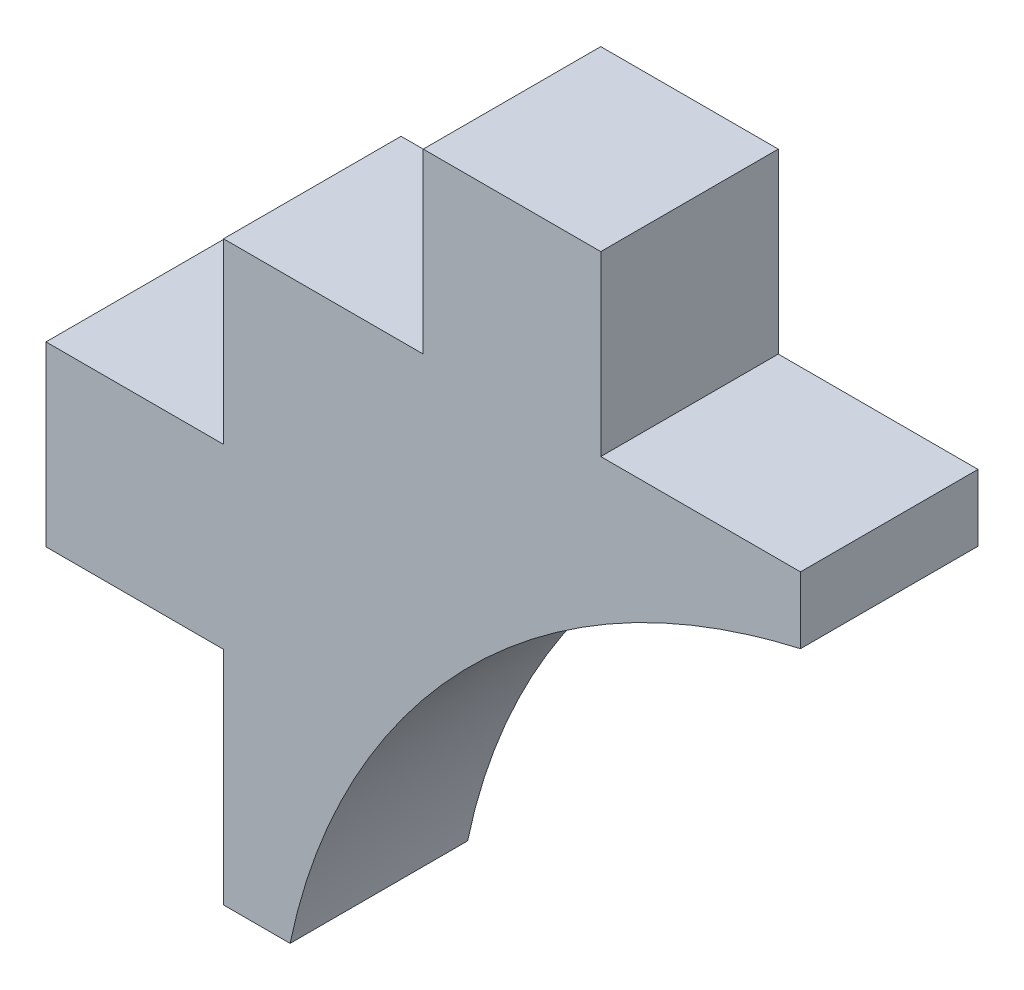
ISO-10303-21;
HEADER;
FILE_DESCRIPTION(('STEP AP214'),'2;1');
FILE_NAME('part.step','',(''),(''),'','','');
FILE_SCHEMA(('AUTOMOTIVE_DESIGN { 1 0 10303 214 1 1 1 1 }'));
ENDSEC;
DATA;
#1=APPLICATION_CONTEXT('core data for automotive mechanical design processes');
#2=APPLICATION_PROTOCOL_DEFINITION('international standard','automotive_design',2000,#1);
#3=PRODUCT_CONTEXT('',#1,'mechanical');
#4=PRODUCT('Part','Part','',(#3));
#5=PRODUCT_RELATED_PRODUCT_CATEGORY('part','',(#4));
#6=PRODUCT_DEFINITION_FORMATION('','',#4);
#7=PRODUCT_DEFINITION_CONTEXT('part definition',#1,'design');
#8=PRODUCT_DEFINITION('design','',#6,#7);
#9=PRODUCT_DEFINITION_SHAPE('','',#8);
#10=(LENGTH_UNIT() NAMED_UNIT(*) SI_UNIT(.MILLI.,.METRE.));
#11=(NAMED_UNIT(*) PLANE_ANGLE_UNIT() SI_UNIT($,.RADIAN.));
#12=(NAMED_UNIT(*) SI_UNIT($,.STERADIAN.) SOLID_ANGLE_UNIT());
#13=UNCERTAINTY_MEASURE_WITH_UNIT(LENGTH_MEASURE(1.E-05),#10,'distance_accuracy_value','');
#14=(GEOMETRIC_REPRESENTATION_CONTEXT(3) GLOBAL_UNCERTAINTY_ASSIGNED_CONTEXT((#13)) GLOBAL_UNIT_ASSIGNED_CONTEXT((#10,
#11,#12)) REPRESENTATION_CONTEXT('',''));
#15=CARTESIAN_POINT('',(0.,0.,0.));
#16=DIRECTION('',(0.,0.,1.));
#17=DIRECTION('',(1.,0.,0.));
#18=AXIS2_PLACEMENT_3D('',#15,#16,#17);
#19=CARTESIAN_POINT('',(0.,4.98785290780557,4.));
#20=DIRECTION('',(1.,0.,0.));
#21=DIRECTION('',(0.,1.,0.));
#22=AXIS2_PLACEMENT_3D('',#19,#20,#21);
#23=PLANE('',#22);
#24=DIRECTION('',(0.,-1.,0.));
#25=VECTOR('',#24,1.);
#26=CARTESIAN_POINT('',(0.,4.98785290780557,0.));
#27=LINE('',#26,#25);
#28=CARTESIAN_POINT('',(0.,4.98785290780557,0.));
#29=VERTEX_POINT('',#28);
#30=CARTESIAN_POINT('',(0.,0.,0.));
#31=VERTEX_POINT('',#30);
#32=EDGE_CURVE('E170',#29,#31,#27,.T.);
#33=ORIENTED_EDGE('',*,*,#32,.T.);
#34=DIRECTION('',(0.,0.,-1.));
#35=VECTOR('',#34,1.);
#36=CARTESIAN_POINT('',(0.,0.,4.));
#37=LINE('',#36,#35);
#38=CARTESIAN_POINT('',(0.,0.,4.));
#39=VERTEX_POINT('',#38);
#40=EDGE_CURVE('E11',#39,#31,#37,.T.);
#41=ORIENTED_EDGE('',*,*,#40,.F.);
#42=DIRECTION('',(0.,-1.,0.));
#43=VECTOR('',#42,1.);
#44=CARTESIAN_POINT('',(0.,4.98785290780557,4.));
#45=LINE('',#44,#43);
#46=CARTESIAN_POINT('',(0.,4.98785290780557,4.));
#47=VERTEX_POINT('',#46);
#48=EDGE_CURVE('E212',#47,#39,#45,.T.);
#49=ORIENTED_EDGE('',*,*,#48,.F.);
#50=DIRECTION('',(0.,0.,-1.));
#51=VECTOR('',#50,1.);
#52=CARTESIAN_POINT('',(0.,4.98785290780557,4.));
#53=LINE('',#52,#51);
#54=EDGE_CURVE('E166',#47,#29,#53,.T.);
#55=ORIENTED_EDGE('',*,*,#54,.T.);
#56=EDGE_LOOP('',(#33,#41,#49,#55));
#57=FACE_BOUND('',#56,.T.);
#58=ADVANCED_FACE('F39',(#57),#23,.F.);
#59=CARTESIAN_POINT('',(0.,0.,4.));
#60=DIRECTION('',(0.,1.,0.));
#61=DIRECTION('',(0.,0.,1.));
#62=AXIS2_PLACEMENT_3D('',#59,#60,#61);
#63=PLANE('',#62);
#64=DIRECTION('',(1.,0.,0.));
#65=VECTOR('',#64,1.);
#66=CARTESIAN_POINT('',(0.,0.,0.));
#67=LINE('',#66,#65);
#68=CARTESIAN_POINT('',(1.5,0.,0.));
#69=VERTEX_POINT('',#68);
#70=EDGE_CURVE('E174',#31,#69,#67,.T.);
#71=ORIENTED_EDGE('',*,*,#70,.T.);
#72=DIRECTION('',(0.,0.,-1.));
#73=VECTOR('',#72,1.);
#74=CARTESIAN_POINT('',(1.5,0.,4.));
#75=LINE('',#74,#73);
#76=CARTESIAN_POINT('',(1.5,0.,4.));
#77=VERTEX_POINT('',#76);
#78=EDGE_CURVE('E48',#77,#69,#75,.T.);
#79=ORIENTED_EDGE('',*,*,#78,.F.);
#80=DIRECTION('',(1.,0.,0.));
#81=VECTOR('',#80,1.);
#82=CARTESIAN_POINT('',(0.,0.,4.));
#83=LINE('',#82,#81);
#84=EDGE_CURVE('E114',#39,#77,#83,.T.);
#85=ORIENTED_EDGE('',*,*,#84,.F.);
#86=ORIENTED_EDGE('',*,*,#40,.T.);
#87=EDGE_LOOP('',(#71,#79,#85,#86));
#88=FACE_BOUND('',#87,.T.);
#89=ADVANCED_FACE('F313',(#88),#63,.F.);
#90=CARTESIAN_POINT('',(1.5,0.,4.));
#91=CARTESIAN_POINT('',(2.5203584895098,4.95036623095251,4.));
#92=CARTESIAN_POINT('',(6.47398622800316,10.0170191379073,4.));
#93=CARTESIAN_POINT('',(13.,11.5,4.));
#94=B_SPLINE_CURVE_WITH_KNOTS('',3,(#90,#91,#92,#93),.UNSPECIFIED.,.F.,.F.,(4,4),(0.,1.),.UNSPECIFIED.);
#95=DIRECTION('',(0.,0.,-1.));
#96=VECTOR('',#95,1.);
#97=SURFACE_OF_LINEAR_EXTRUSION('',#94,#96);
#98=CARTESIAN_POINT('',(1.5,0.,0.));
#99=CARTESIAN_POINT('',(2.5203584895098,4.95036623095251,0.));
#100=CARTESIAN_POINT('',(6.47398622800316,10.0170191379073,0.));
#101=CARTESIAN_POINT('',(13.,11.5,0.));
#102=B_SPLINE_CURVE_WITH_KNOTS('',3,(#98,#99,#100,#101),.UNSPECIFIED.,.F.,.F.,(4,4),(0.,1.),.UNSPECIFIED.);
#103=CARTESIAN_POINT('',(13.,11.5,0.));
#104=VERTEX_POINT('',#103);
#105=EDGE_CURVE('E177',#69,#104,#102,.T.);
#106=ORIENTED_EDGE('',*,*,#105,.T.);
#107=DIRECTION('',(0.,0.,-1.));
#108=VECTOR('',#107,1.);
#109=CARTESIAN_POINT('',(13.,11.5,4.));
#110=LINE('',#109,#108);
#111=CARTESIAN_POINT('',(13.,11.5,4.));
#112=VERTEX_POINT('',#111);
#113=EDGE_CURVE('E243',#112,#104,#110,.T.);
#114=ORIENTED_EDGE('',*,*,#113,.F.);
#115=EDGE_CURVE('E253',#77,#112,#94,.T.);
#116=ORIENTED_EDGE('',*,*,#115,.F.);
#117=ORIENTED_EDGE('',*,*,#78,.T.);
#118=EDGE_LOOP('',(#106,#114,#116,#117));
#119=FACE_BOUND('',#118,.T.);
#120=ADVANCED_FACE('F251',(#119),#97,.F.);
#121=CARTESIAN_POINT('',(13.,13.,4.));
#122=DIRECTION('',(-1.,0.,0.));
#123=DIRECTION('',(0.,0.,1.));
#124=AXIS2_PLACEMENT_3D('',#121,#122,#123);
#125=PLANE('',#124);
#126=DIRECTION('',(0.,1.,0.));
#127=VECTOR('',#126,1.);
#128=CARTESIAN_POINT('',(13.,13.,0.));
#129=LINE('',#128,#127);
#130=CARTESIAN_POINT('',(13.,13.,0.));
#131=VERTEX_POINT('',#130);
#132=EDGE_CURVE('E182',#104,#131,#129,.T.);
#133=ORIENTED_EDGE('',*,*,#132,.T.);
#134=DIRECTION('',(0.,0.,-1.));
#135=VECTOR('',#134,1.);
#136=CARTESIAN_POINT('',(13.,13.,4.));
#137=LINE('',#136,#135);
#138=CARTESIAN_POINT('',(13.,13.,4.));
#139=VERTEX_POINT('',#138);
#140=EDGE_CURVE('E239',#139,#131,#137,.T.);
#141=ORIENTED_EDGE('',*,*,#140,.F.);
#142=DIRECTION('',(0.,1.,0.));
#143=VECTOR('',#142,1.);
#144=CARTESIAN_POINT('',(13.,13.,4.));
#145=LINE('',#144,#143);
#146=EDGE_CURVE('E272',#112,#139,#145,.T.);
#147=ORIENTED_EDGE('',*,*,#146,.F.);
#148=ORIENTED_EDGE('',*,*,#113,.T.);
#149=EDGE_LOOP('',(#133,#141,#147,#148));
#150=FACE_BOUND('',#149,.T.);
#151=ADVANCED_FACE('F262',(#150),#125,.F.);
#152=CARTESIAN_POINT('',(8.5,13.,4.));
#153=DIRECTION('',(0.,-1.,0.));
#154=DIRECTION('',(0.,0.,-1.));
#155=AXIS2_PLACEMENT_3D('',#152,#153,#154);
#156=PLANE('',#155);
#157=DIRECTION('',(-1.,0.,0.));
#158=VECTOR('',#157,1.);
#159=CARTESIAN_POINT('',(8.5,13.,0.));
#160=LINE('',#159,#158);
#161=CARTESIAN_POINT('',(8.5,13.,0.));
#162=VERTEX_POINT('',#161);
#163=EDGE_CURVE('E188',#131,#162,#160,.T.);
#164=ORIENTED_EDGE('',*,*,#163,.T.);
#165=DIRECTION('',(0.,0.,-1.));
#166=VECTOR('',#165,1.);
#167=CARTESIAN_POINT('',(8.5,13.,4.));
#168=LINE('',#167,#166);
#169=CARTESIAN_POINT('',(8.5,13.,4.));
#170=VERTEX_POINT('',#169);
#171=EDGE_CURVE('E235',#170,#162,#168,.T.);
#172=ORIENTED_EDGE('',*,*,#171,.F.);
#173=DIRECTION('',(-1.,0.,0.));
#174=VECTOR('',#173,1.);
#175=CARTESIAN_POINT('',(8.5,13.,4.));
#176=LINE('',#175,#174);
#177=EDGE_CURVE('E268',#139,#170,#176,.T.);
#178=ORIENTED_EDGE('',*,*,#177,.F.);
#179=ORIENTED_EDGE('',*,*,#140,.T.);
#180=EDGE_LOOP('',(#164,#172,#178,#179));
#181=FACE_BOUND('',#180,.T.);
#182=ADVANCED_FACE('F266',(#181),#156,.F.);
#183=CARTESIAN_POINT('',(8.5,17.,4.));
#184=DIRECTION('',(-1.,0.,0.));
#185=DIRECTION('',(0.,0.,1.));
#186=AXIS2_PLACEMENT_3D('',#183,#184,#185);
#187=PLANE('',#186);
#188=DIRECTION('',(0.,1.,0.));
#189=VECTOR('',#188,1.);
#190=CARTESIAN_POINT('',(8.5,17.,0.));
#191=LINE('',#190,#189);
#192=CARTESIAN_POINT('',(8.5,17.,0.));
#193=VERTEX_POINT('',#192);
#194=EDGE_CURVE('E191',#162,#193,#191,.T.);
#195=ORIENTED_EDGE('',*,*,#194,.T.);
#196=DIRECTION('',(0.,0.,-1.));
#197=VECTOR('',#196,1.);
#198=CARTESIAN_POINT('',(8.5,17.,4.));
#199=LINE('',#198,#197);
#200=CARTESIAN_POINT('',(8.5,17.,4.));
#201=VERTEX_POINT('',#200);
#202=EDGE_CURVE('E231',#201,#193,#199,.T.);
#203=ORIENTED_EDGE('',*,*,#202,.F.);
#204=DIRECTION('',(0.,1.,0.));
#205=VECTOR('',#204,1.);
#206=CARTESIAN_POINT('',(8.5,17.,4.));
#207=LINE('',#206,#205);
#208=EDGE_CURVE('E271',#170,#201,#207,.T.);
#209=ORIENTED_EDGE('',*,*,#208,.F.);
#210=ORIENTED_EDGE('',*,*,#171,.T.);
#211=EDGE_LOOP('',(#195,#203,#209,#210));
#212=FACE_BOUND('',#211,.T.);
#213=ADVANCED_FACE('F337',(#212),#187,.F.);
#214=CARTESIAN_POINT('',(4.5,17.,4.));
#215=DIRECTION('',(0.,-1.,0.));
#216=DIRECTION('',(0.,0.,-1.));
#217=AXIS2_PLACEMENT_3D('',#214,#215,#216);
#218=PLANE('',#217);
#219=DIRECTION('',(-1.,0.,0.));
#220=VECTOR('',#219,1.);
#221=CARTESIAN_POINT('',(4.5,17.,0.));
#222=LINE('',#221,#220);
#223=CARTESIAN_POINT('',(4.5,17.,0.));
#224=VERTEX_POINT('',#223);
#225=EDGE_CURVE('E194',#193,#224,#222,.T.);
#226=ORIENTED_EDGE('',*,*,#225,.T.);
#227=DIRECTION('',(0.,0.,-1.));
#228=VECTOR('',#227,1.);
#229=CARTESIAN_POINT('',(4.5,17.,4.));
#230=LINE('',#229,#228);
#231=CARTESIAN_POINT('',(4.5,17.,4.));
#232=VERTEX_POINT('',#231);
#233=EDGE_CURVE('E227',#232,#224,#230,.T.);
#234=ORIENTED_EDGE('',*,*,#233,.F.);
#235=DIRECTION('',(-1.,0.,0.));
#236=VECTOR('',#235,1.);
#237=CARTESIAN_POINT('',(4.5,17.,4.));
#238=LINE('',#237,#236);
#239=EDGE_CURVE('E276',#201,#232,#238,.T.);
#240=ORIENTED_EDGE('',*,*,#239,.F.);
#241=ORIENTED_EDGE('',*,*,#202,.T.);
#242=EDGE_LOOP('',(#226,#234,#240,#241));
#243=FACE_BOUND('',#242,.T.);
#244=ADVANCED_FACE('F340',(#243),#218,.F.);
#245=CARTESIAN_POINT('',(4.5,13.,4.));
#246=DIRECTION('',(1.,0.,0.));
#247=DIRECTION('',(0.,1.,0.));
#248=AXIS2_PLACEMENT_3D('',#245,#246,#247);
#249=PLANE('',#248);
#250=DIRECTION('',(0.,-1.,0.));
#251=VECTOR('',#250,1.);
#252=CARTESIAN_POINT('',(4.5,13.,0.));
#253=LINE('',#252,#251);
#254=CARTESIAN_POINT('',(4.5,13.,0.));
#255=VERTEX_POINT('',#254);
#256=EDGE_CURVE('E197',#224,#255,#253,.T.);
#257=ORIENTED_EDGE('',*,*,#256,.T.);
#258=DIRECTION('',(0.,0.,-1.));
#259=VECTOR('',#258,1.);
#260=CARTESIAN_POINT('',(4.5,13.,4.));
#261=LINE('',#260,#259);
#262=CARTESIAN_POINT('',(4.5,13.,4.));
#263=VERTEX_POINT('',#262);
#264=EDGE_CURVE('E223',#263,#255,#261,.T.);
#265=ORIENTED_EDGE('',*,*,#264,.F.);
#266=DIRECTION('',(0.,-1.,0.));
#267=VECTOR('',#266,1.);
#268=CARTESIAN_POINT('',(4.5,13.,4.));
#269=LINE('',#268,#267);
#270=EDGE_CURVE('E283',#232,#263,#269,.T.);
#271=ORIENTED_EDGE('',*,*,#270,.F.);
#272=ORIENTED_EDGE('',*,*,#233,.T.);
#273=EDGE_LOOP('',(#257,#265,#271,#272));
#274=FACE_BOUND('',#273,.T.);
#275=ADVANCED_FACE('F344',(#274),#249,.F.);
#276=CARTESIAN_POINT('',(0.,13.,4.));
#277=DIRECTION('',(0.,-1.,0.));
#278=DIRECTION('',(0.,0.,-1.));
#279=AXIS2_PLACEMENT_3D('',#276,#277,#278);
#280=PLANE('',#279);
#281=DIRECTION('',(-1.,0.,0.));
#282=VECTOR('',#281,1.);
#283=CARTESIAN_POINT('',(0.,13.,0.));
#284=LINE('',#283,#282);
#285=CARTESIAN_POINT('',(0.,13.,0.));
#286=VERTEX_POINT('',#285);
#287=EDGE_CURVE('E200',#255,#286,#284,.T.);
#288=ORIENTED_EDGE('',*,*,#287,.T.);
#289=DIRECTION('',(0.,0.,-1.));
#290=VECTOR('',#289,1.);
#291=CARTESIAN_POINT('',(0.,13.,4.));
#292=LINE('',#291,#290);
#293=CARTESIAN_POINT('',(0.,13.,4.));
#294=VERTEX_POINT('',#293);
#295=EDGE_CURVE('E219',#294,#286,#292,.T.);
#296=ORIENTED_EDGE('',*,*,#295,.F.);
#297=DIRECTION('',(-1.,0.,0.));
#298=VECTOR('',#297,1.);
#299=CARTESIAN_POINT('',(0.,13.,4.));
#300=LINE('',#299,#298);
#301=EDGE_CURVE('E286',#263,#294,#300,.T.);
#302=ORIENTED_EDGE('',*,*,#301,.F.);
#303=ORIENTED_EDGE('',*,*,#264,.T.);
#304=EDGE_LOOP('',(#288,#296,#302,#303));
#305=FACE_BOUND('',#304,.T.);
#306=ADVANCED_FACE('F294',(#305),#280,.F.);
#307=CARTESIAN_POINT('',(0.,13.,4.));
#308=DIRECTION('',(1.,0.,0.));
#309=DIRECTION('',(0.,0.,-1.));
#310=AXIS2_PLACEMENT_3D('',#307,#308,#309);
#311=PLANE('',#310);
#312=DIRECTION('',(0.,-1.,0.));
#313=VECTOR('',#312,1.);
#314=CARTESIAN_POINT('',(0.,13.,0.));
#315=LINE('',#314,#313);
#316=CARTESIAN_POINT('',(0.,8.98785290780557,0.));
#317=VERTEX_POINT('',#316);
#318=EDGE_CURVE('E203',#286,#317,#315,.T.);
#319=ORIENTED_EDGE('',*,*,#318,.T.);
#320=DIRECTION('',(0.,0.,-1.));
#321=VECTOR('',#320,1.);
#322=CARTESIAN_POINT('',(0.,8.98785290780557,4.));
#323=LINE('',#322,#321);
#324=CARTESIAN_POINT('',(0.,8.98785290780557,4.));
#325=VERTEX_POINT('',#324);
#326=EDGE_CURVE('E159',#325,#317,#323,.T.);
#327=ORIENTED_EDGE('',*,*,#326,.F.);
#328=DIRECTION('',(0.,-1.,0.));
#329=VECTOR('',#328,1.);
#330=CARTESIAN_POINT('',(0.,13.,4.));
#331=LINE('',#330,#329);
#332=EDGE_CURVE('E148',#294,#325,#331,.T.);
#333=ORIENTED_EDGE('',*,*,#332,.F.);
#334=ORIENTED_EDGE('',*,*,#295,.T.);
#335=EDGE_LOOP('',(#319,#327,#333,#334));
#336=FACE_BOUND('',#335,.T.);
#337=ADVANCED_FACE('F298',(#336),#311,.F.);
#338=CARTESIAN_POINT('',(0.,8.98785290780557,4.));
#339=DIRECTION('',(0.,-1.,0.));
#340=DIRECTION('',(0.,0.,-1.));
#341=AXIS2_PLACEMENT_3D('',#338,#339,#340);
#342=PLANE('',#341);
#343=DIRECTION('',(-1.,0.,0.));
#344=VECTOR('',#343,1.);
#345=CARTESIAN_POINT('',(0.,8.98785290780557,0.));
#346=LINE('',#345,#344);
#347=CARTESIAN_POINT('',(-4.,8.98785290780557,0.));
#348=VERTEX_POINT('',#347);
#349=EDGE_CURVE('E157',#317,#348,#346,.T.);
#350=ORIENTED_EDGE('',*,*,#349,.T.);
#351=DIRECTION('',(0.,0.,-1.));
#352=VECTOR('',#351,1.);
#353=CARTESIAN_POINT('',(-4.,8.98785290780557,4.));
#354=LINE('',#353,#352);
#355=CARTESIAN_POINT('',(-4.,8.98785290780557,4.));
#356=VERTEX_POINT('',#355);
#357=EDGE_CURVE('E154',#356,#348,#354,.T.);
#358=ORIENTED_EDGE('',*,*,#357,.F.);
#359=DIRECTION('',(-1.,0.,0.));
#360=VECTOR('',#359,1.);
#361=CARTESIAN_POINT('',(0.,8.98785290780557,4.));
#362=LINE('',#361,#360);
#363=EDGE_CURVE('E142',#325,#356,#362,.T.);
#364=ORIENTED_EDGE('',*,*,#363,.F.);
#365=ORIENTED_EDGE('',*,*,#326,.T.);
#366=EDGE_LOOP('',(#350,#358,#364,#365));
#367=FACE_BOUND('',#366,.T.);
#368=ADVANCED_FACE('F155',(#367),#342,.F.);
#369=CARTESIAN_POINT('',(-4.,8.98785290780557,4.));
#370=DIRECTION('',(1.,0.,0.));
#371=DIRECTION('',(0.,1.,0.));
#372=AXIS2_PLACEMENT_3D('',#369,#370,#371);
#373=PLANE('',#372);
#374=DIRECTION('',(0.,-1.,0.));
#375=VECTOR('',#374,1.);
#376=CARTESIAN_POINT('',(-4.,8.98785290780557,0.));
#377=LINE('',#376,#375);
#378=CARTESIAN_POINT('',(-4.,4.98785290780557,0.));
#379=VERTEX_POINT('',#378);
#380=EDGE_CURVE('E100',#348,#379,#377,.T.);
#381=ORIENTED_EDGE('',*,*,#380,.T.);
#382=DIRECTION('',(0.,0.,-1.));
#383=VECTOR('',#382,1.);
#384=CARTESIAN_POINT('',(-4.,4.98785290780557,4.));
#385=LINE('',#384,#383);
#386=CARTESIAN_POINT('',(-4.,4.98785290780557,4.));
#387=VERTEX_POINT('',#386);
#388=EDGE_CURVE('E160',#387,#379,#385,.T.);
#389=ORIENTED_EDGE('',*,*,#388,.F.);
#390=DIRECTION('',(0.,-1.,0.));
#391=VECTOR('',#390,1.);
#392=CARTESIAN_POINT('',(-4.,8.98785290780557,4.));
#393=LINE('',#392,#391);
#394=EDGE_CURVE('E146',#356,#387,#393,.T.);
#395=ORIENTED_EDGE('',*,*,#394,.F.);
#396=ORIENTED_EDGE('',*,*,#357,.T.);
#397=EDGE_LOOP('',(#381,#389,#395,#396));
#398=FACE_BOUND('',#397,.T.);
#399=ADVANCED_FACE('F162',(#398),#373,.F.);
#400=CARTESIAN_POINT('',(0.,4.98785290780557,4.));
#401=DIRECTION('',(0.,1.,0.));
#402=DIRECTION('',(-1.,0.,0.));
#403=AXIS2_PLACEMENT_3D('',#400,#401,#402);
#404=PLANE('',#403);
#405=DIRECTION('',(1.,0.,0.));
#406=VECTOR('',#405,1.);
#407=CARTESIAN_POINT('',(0.,4.98785290780557,0.));
#408=LINE('',#407,#406);
#409=EDGE_CURVE('E106',#379,#29,#408,.T.);
#410=ORIENTED_EDGE('',*,*,#409,.T.);
#411=ORIENTED_EDGE('',*,*,#54,.F.);
#412=DIRECTION('',(1.,0.,0.));
#413=VECTOR('',#412,1.);
#414=CARTESIAN_POINT('',(0.,4.98785290780557,4.));
#415=LINE('',#414,#413);
#416=EDGE_CURVE('E56',#387,#47,#415,.T.);
#417=ORIENTED_EDGE('',*,*,#416,.F.);
#418=ORIENTED_EDGE('',*,*,#388,.T.);
#419=EDGE_LOOP('',(#410,#411,#417,#418));
#420=FACE_BOUND('',#419,.T.);
#421=ADVANCED_FACE('F302',(#420),#404,.F.);
#422=CARTESIAN_POINT('',(5.18537926906736,7.05026951332243,4.));
#423=DIRECTION('',(0.,0.,1.));
#424=DIRECTION('',(1.,0.,0.));
#425=AXIS2_PLACEMENT_3D('',#422,#423,#424);
#426=PLANE('',#425);
#427=ORIENTED_EDGE('',*,*,#48,.T.);
#428=ORIENTED_EDGE('',*,*,#84,.T.);
#429=ORIENTED_EDGE('',*,*,#115,.T.);
#430=ORIENTED_EDGE('',*,*,#146,.T.);
#431=ORIENTED_EDGE('',*,*,#177,.T.);
#432=ORIENTED_EDGE('',*,*,#208,.T.);
#433=ORIENTED_EDGE('',*,*,#239,.T.);
#434=ORIENTED_EDGE('',*,*,#270,.T.);
#435=ORIENTED_EDGE('',*,*,#301,.T.);
#436=ORIENTED_EDGE('',*,*,#332,.T.);
#437=ORIENTED_EDGE('',*,*,#363,.T.);
#438=ORIENTED_EDGE('',*,*,#394,.T.);
#439=ORIENTED_EDGE('',*,*,#416,.T.);
#440=EDGE_LOOP('',(#427,#428,#429,#430,#431,#432,#433,#434,#435,#436,#437,#438,#439));
#441=FACE_BOUND('',#440,.T.);
#442=ADVANCED_FACE('F144',(#441),#426,.T.);
#443=CARTESIAN_POINT('',(5.18537926906736,7.05026951332243,0.));
#444=DIRECTION('',(0.,0.,1.));
#445=DIRECTION('',(1.,0.,0.));
#446=AXIS2_PLACEMENT_3D('',#443,#444,#445);
#447=PLANE('',#446);
#448=ORIENTED_EDGE('',*,*,#32,.F.);
#449=ORIENTED_EDGE('',*,*,#409,.F.);
#450=ORIENTED_EDGE('',*,*,#380,.F.);
#451=ORIENTED_EDGE('',*,*,#349,.F.);
#452=ORIENTED_EDGE('',*,*,#318,.F.);
#453=ORIENTED_EDGE('',*,*,#287,.F.);
#454=ORIENTED_EDGE('',*,*,#256,.F.);
#455=ORIENTED_EDGE('',*,*,#225,.F.);
#456=ORIENTED_EDGE('',*,*,#194,.F.);
#457=ORIENTED_EDGE('',*,*,#163,.F.);
#458=ORIENTED_EDGE('',*,*,#132,.F.);
#459=ORIENTED_EDGE('',*,*,#105,.F.);
#460=ORIENTED_EDGE('',*,*,#70,.F.);
#461=EDGE_LOOP('',(#448,#449,#450,#451,#452,#453,#454,#455,#456,#457,#458,#459,#460));
#462=FACE_BOUND('',#461,.T.);
#463=ADVANCED_FACE('F257',(#462),#447,.F.);
#464=CLOSED_SHELL('',(#58,#89,#120,#151,#182,#213,#244,#275,#306,#337,#368,#399,#421,#442,#463));
#465=MANIFOLD_SOLID_BREP('B2',#464);
#466=ADVANCED_BREP_SHAPE_REPRESENTATION('',(#18,#465),#14);
#467=SHAPE_DEFINITION_REPRESENTATION(#9,#466);
ENDSEC;
END-ISO-10303-21;
